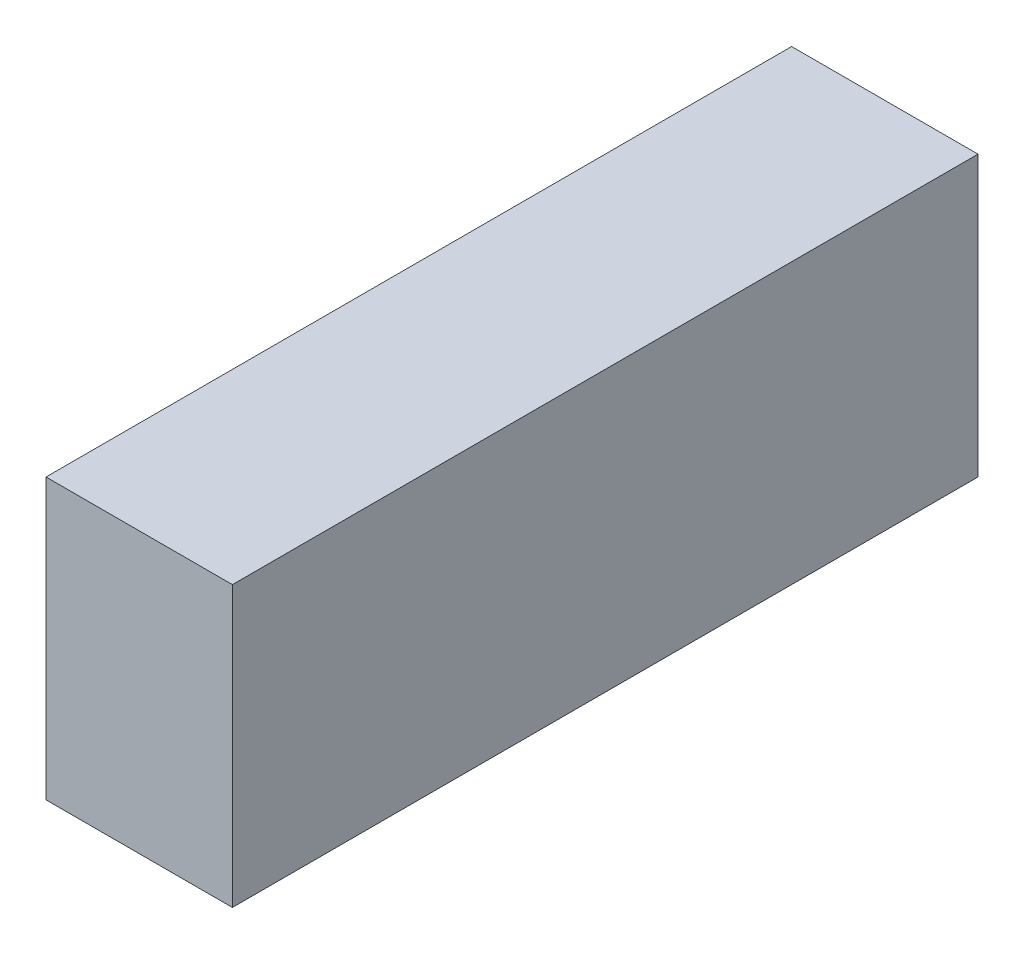
ISO-10303-21;
HEADER;
FILE_DESCRIPTION(('STEP AP214'),'2;1');
FILE_NAME('part.step','',(''),(''),'','','');
FILE_SCHEMA(('AUTOMOTIVE_DESIGN { 1 0 10303 214 1 1 1 1 }'));
ENDSEC;
DATA;
#1=APPLICATION_CONTEXT('core data for automotive mechanical design processes');
#2=APPLICATION_PROTOCOL_DEFINITION('international standard','automotive_design',2000,#1);
#3=PRODUCT_CONTEXT('',#1,'mechanical');
#4=PRODUCT('Part','Part','',(#3));
#5=PRODUCT_RELATED_PRODUCT_CATEGORY('part','',(#4));
#6=PRODUCT_DEFINITION_FORMATION('','',#4);
#7=PRODUCT_DEFINITION_CONTEXT('part definition',#1,'design');
#8=PRODUCT_DEFINITION('design','',#6,#7);
#9=PRODUCT_DEFINITION_SHAPE('','',#8);
#10=(LENGTH_UNIT() NAMED_UNIT(*) SI_UNIT(.MILLI.,.METRE.));
#11=(NAMED_UNIT(*) PLANE_ANGLE_UNIT() SI_UNIT($,.RADIAN.));
#12=(NAMED_UNIT(*) SI_UNIT($,.STERADIAN.) SOLID_ANGLE_UNIT());
#13=UNCERTAINTY_MEASURE_WITH_UNIT(LENGTH_MEASURE(1.E-05),#10,'distance_accuracy_value','');
#14=(GEOMETRIC_REPRESENTATION_CONTEXT(3) GLOBAL_UNCERTAINTY_ASSIGNED_CONTEXT((#13)) GLOBAL_UNIT_ASSIGNED_CONTEXT((#10,
#11,#12)) REPRESENTATION_CONTEXT('',''));
#15=CARTESIAN_POINT('',(0.,0.,0.));
#16=DIRECTION('',(0.,0.,1.));
#17=DIRECTION('',(1.,0.,0.));
#18=AXIS2_PLACEMENT_3D('',#15,#16,#17);
#19=CARTESIAN_POINT('',(2.,33.,-80.));
#20=DIRECTION('',(-1.,0.,0.));
#21=DIRECTION('',(0.,0.,1.));
#22=AXIS2_PLACEMENT_3D('',#19,#20,#21);
#23=PLANE('',#22);
#24=DIRECTION('',(0.,-1.,0.));
#25=VECTOR('',#24,1.);
#26=CARTESIAN_POINT('',(2.,33.,-40.));
#27=LINE('',#26,#25);
#28=CARTESIAN_POINT('',(2.,48.,-40.));
#29=VERTEX_POINT('',#28);
#30=CARTESIAN_POINT('',(2.,33.,-40.));
#31=VERTEX_POINT('',#30);
#32=EDGE_CURVE('E103',#29,#31,#27,.T.);
#33=ORIENTED_EDGE('',*,*,#32,.F.);
#34=DIRECTION('',(0.,0.,1.));
#35=VECTOR('',#34,1.);
#36=CARTESIAN_POINT('',(2.,48.,-80.));
#37=LINE('',#36,#35);
#38=CARTESIAN_POINT('',(2.,48.,-80.));
#39=VERTEX_POINT('',#38);
#40=EDGE_CURVE('E11',#39,#29,#37,.T.);
#41=ORIENTED_EDGE('',*,*,#40,.F.);
#42=DIRECTION('',(0.,-1.,0.));
#43=VECTOR('',#42,1.);
#44=CARTESIAN_POINT('',(2.,33.,-80.));
#45=LINE('',#44,#43);
#46=CARTESIAN_POINT('',(2.,33.,-80.));
#47=VERTEX_POINT('',#46);
#48=EDGE_CURVE('E97',#39,#47,#45,.T.);
#49=ORIENTED_EDGE('',*,*,#48,.T.);
#50=DIRECTION('',(0.,0.,1.));
#51=VECTOR('',#50,1.);
#52=CARTESIAN_POINT('',(2.,33.,-80.));
#53=LINE('',#52,#51);
#54=EDGE_CURVE('E42',#47,#31,#53,.T.);
#55=ORIENTED_EDGE('',*,*,#54,.T.);
#56=EDGE_LOOP('',(#33,#41,#49,#55));
#57=FACE_BOUND('',#56,.T.);
#58=ADVANCED_FACE('F39',(#57),#23,.T.);
#59=CARTESIAN_POINT('',(2.,48.,-80.));
#60=DIRECTION('',(0.,1.,0.));
#61=DIRECTION('',(0.,0.,1.));
#62=AXIS2_PLACEMENT_3D('',#59,#60,#61);
#63=PLANE('',#62);
#64=DIRECTION('',(-1.,0.,0.));
#65=VECTOR('',#64,1.);
#66=CARTESIAN_POINT('',(2.,48.,-40.));
#67=LINE('',#66,#65);
#68=CARTESIAN_POINT('',(12.,48.,-40.));
#69=VERTEX_POINT('',#68);
#70=EDGE_CURVE('E99',#69,#29,#67,.T.);
#71=ORIENTED_EDGE('',*,*,#70,.F.);
#72=DIRECTION('',(0.,0.,1.));
#73=VECTOR('',#72,1.);
#74=CARTESIAN_POINT('',(12.,48.,-80.));
#75=LINE('',#74,#73);
#76=CARTESIAN_POINT('',(12.,48.,-80.));
#77=VERTEX_POINT('',#76);
#78=EDGE_CURVE('E48',#77,#69,#75,.T.);
#79=ORIENTED_EDGE('',*,*,#78,.F.);
#80=DIRECTION('',(-1.,0.,0.));
#81=VECTOR('',#80,1.);
#82=CARTESIAN_POINT('',(2.,48.,-80.));
#83=LINE('',#82,#81);
#84=EDGE_CURVE('E94',#77,#39,#83,.T.);
#85=ORIENTED_EDGE('',*,*,#84,.T.);
#86=ORIENTED_EDGE('',*,*,#40,.T.);
#87=EDGE_LOOP('',(#71,#79,#85,#86));
#88=FACE_BOUND('',#87,.T.);
#89=ADVANCED_FACE('F113',(#88),#63,.T.);
#90=CARTESIAN_POINT('',(12.,33.,-80.));
#91=DIRECTION('',(1.,0.,0.));
#92=DIRECTION('',(0.,0.,-1.));
#93=AXIS2_PLACEMENT_3D('',#90,#91,#92);
#94=PLANE('',#93);
#95=DIRECTION('',(0.,1.,0.));
#96=VECTOR('',#95,1.);
#97=CARTESIAN_POINT('',(12.,33.,-40.));
#98=LINE('',#97,#96);
#99=CARTESIAN_POINT('',(12.,33.,-40.));
#100=VERTEX_POINT('',#99);
#101=EDGE_CURVE('E89',#100,#69,#98,.T.);
#102=ORIENTED_EDGE('',*,*,#101,.F.);
#103=DIRECTION('',(0.,0.,1.));
#104=VECTOR('',#103,1.);
#105=CARTESIAN_POINT('',(12.,33.,-80.));
#106=LINE('',#105,#104);
#107=CARTESIAN_POINT('',(12.,33.,-80.));
#108=VERTEX_POINT('',#107);
#109=EDGE_CURVE('E84',#108,#100,#106,.T.);
#110=ORIENTED_EDGE('',*,*,#109,.F.);
#111=DIRECTION('',(0.,1.,0.));
#112=VECTOR('',#111,1.);
#113=CARTESIAN_POINT('',(12.,33.,-80.));
#114=LINE('',#113,#112);
#115=EDGE_CURVE('E87',#108,#77,#114,.T.);
#116=ORIENTED_EDGE('',*,*,#115,.T.);
#117=ORIENTED_EDGE('',*,*,#78,.T.);
#118=EDGE_LOOP('',(#102,#110,#116,#117));
#119=FACE_BOUND('',#118,.T.);
#120=ADVANCED_FACE('F86',(#119),#94,.T.);
#121=CARTESIAN_POINT('',(2.,33.,-80.));
#122=DIRECTION('',(0.,-1.,0.));
#123=DIRECTION('',(0.,0.,-1.));
#124=AXIS2_PLACEMENT_3D('',#121,#122,#123);
#125=PLANE('',#124);
#126=DIRECTION('',(1.,0.,0.));
#127=VECTOR('',#126,1.);
#128=CARTESIAN_POINT('',(2.,33.,-40.));
#129=LINE('',#128,#127);
#130=EDGE_CURVE('E106',#31,#100,#129,.T.);
#131=ORIENTED_EDGE('',*,*,#130,.F.);
#132=ORIENTED_EDGE('',*,*,#54,.F.);
#133=DIRECTION('',(1.,0.,0.));
#134=VECTOR('',#133,1.);
#135=CARTESIAN_POINT('',(2.,33.,-80.));
#136=LINE('',#135,#134);
#137=EDGE_CURVE('E93',#47,#108,#136,.T.);
#138=ORIENTED_EDGE('',*,*,#137,.T.);
#139=ORIENTED_EDGE('',*,*,#109,.T.);
#140=EDGE_LOOP('',(#131,#132,#138,#139));
#141=FACE_BOUND('',#140,.T.);
#142=ADVANCED_FACE('F96',(#141),#125,.T.);
#143=CARTESIAN_POINT('',(0.,0.,-80.));
#144=DIRECTION('',(0.,0.,-1.));
#145=DIRECTION('',(-1.,0.,0.));
#146=AXIS2_PLACEMENT_3D('',#143,#144,#145);
#147=PLANE('',#146);
#148=ORIENTED_EDGE('',*,*,#48,.F.);
#149=ORIENTED_EDGE('',*,*,#84,.F.);
#150=ORIENTED_EDGE('',*,*,#115,.F.);
#151=ORIENTED_EDGE('',*,*,#137,.F.);
#152=EDGE_LOOP('',(#148,#149,#150,#151));
#153=FACE_BOUND('',#152,.T.);
#154=ADVANCED_FACE('F92',(#153),#147,.T.);
#155=CARTESIAN_POINT('',(0.,0.,-40.));
#156=DIRECTION('',(0.,0.,-1.));
#157=DIRECTION('',(-1.,0.,0.));
#158=AXIS2_PLACEMENT_3D('',#155,#156,#157);
#159=PLANE('',#158);
#160=ORIENTED_EDGE('',*,*,#32,.T.);
#161=ORIENTED_EDGE('',*,*,#130,.T.);
#162=ORIENTED_EDGE('',*,*,#101,.T.);
#163=ORIENTED_EDGE('',*,*,#70,.T.);
#164=EDGE_LOOP('',(#160,#161,#162,#163));
#165=FACE_BOUND('',#164,.T.);
#166=ADVANCED_FACE('F112',(#165),#159,.F.);
#167=CLOSED_SHELL('',(#58,#89,#120,#142,#154,#166));
#168=MANIFOLD_SOLID_BREP('B2',#167);
#169=ADVANCED_BREP_SHAPE_REPRESENTATION('',(#18,#168),#14);
#170=SHAPE_DEFINITION_REPRESENTATION(#9,#169);
ENDSEC;
END-ISO-10303-21;
